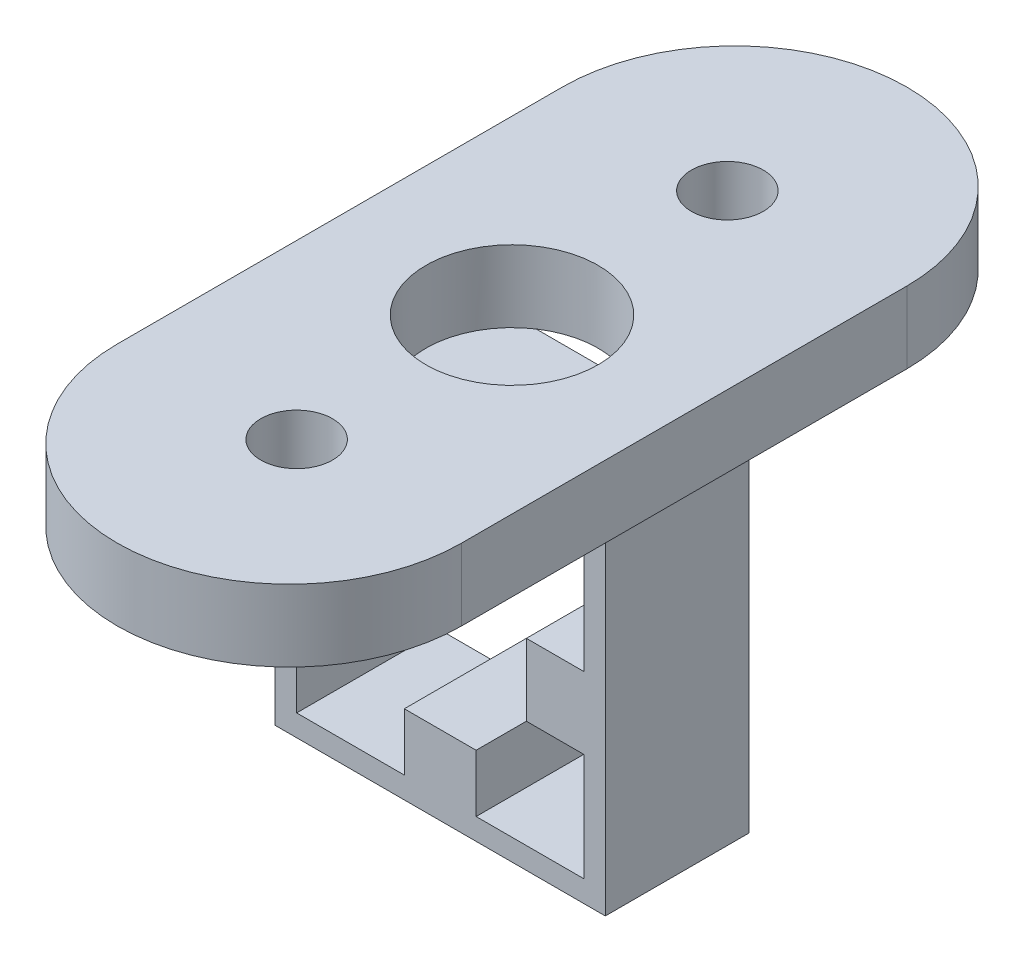
ISO-10303-21;
HEADER;
FILE_DESCRIPTION(('STEP AP214'),'2;1');
FILE_NAME('part.step','',(''),(''),'','','');
FILE_SCHEMA(('AUTOMOTIVE_DESIGN { 1 0 10303 214 1 1 1 1 }'));
ENDSEC;
DATA;
#1=APPLICATION_CONTEXT('core data for automotive mechanical design processes');
#2=APPLICATION_PROTOCOL_DEFINITION('international standard','automotive_design',2000,#1);
#3=PRODUCT_CONTEXT('',#1,'mechanical');
#4=PRODUCT('Part','Part','',(#3));
#5=PRODUCT_RELATED_PRODUCT_CATEGORY('part','',(#4));
#6=PRODUCT_DEFINITION_FORMATION('','',#4);
#7=PRODUCT_DEFINITION_CONTEXT('part definition',#1,'design');
#8=PRODUCT_DEFINITION('design','',#6,#7);
#9=PRODUCT_DEFINITION_SHAPE('','',#8);
#10=(LENGTH_UNIT() NAMED_UNIT(*) SI_UNIT(.MILLI.,.METRE.));
#11=(NAMED_UNIT(*) PLANE_ANGLE_UNIT() SI_UNIT($,.RADIAN.));
#12=(NAMED_UNIT(*) SI_UNIT($,.STERADIAN.) SOLID_ANGLE_UNIT());
#13=UNCERTAINTY_MEASURE_WITH_UNIT(LENGTH_MEASURE(1.E-05),#10,'distance_accuracy_value','');
#14=(GEOMETRIC_REPRESENTATION_CONTEXT(3) GLOBAL_UNCERTAINTY_ASSIGNED_CONTEXT((#13)) GLOBAL_UNIT_ASSIGNED_CONTEXT((#10,
#11,#12)) REPRESENTATION_CONTEXT('',''));
#15=CARTESIAN_POINT('',(0.,0.,0.));
#16=DIRECTION('',(0.,0.,1.));
#17=DIRECTION('',(1.,0.,0.));
#18=AXIS2_PLACEMENT_3D('',#15,#16,#17);
#19=CARTESIAN_POINT('',(11.5,11.5,10.));
#20=DIRECTION('',(0.,-1.,0.));
#21=DIRECTION('',(0.,0.,-1.));
#22=AXIS2_PLACEMENT_3D('',#19,#20,#21);
#23=PLANE('',#22);
#24=DIRECTION('',(-1.,0.,0.));
#25=VECTOR('',#24,1.);
#26=CARTESIAN_POINT('',(11.5,11.5,10.));
#27=LINE('',#26,#25);
#28=CARTESIAN_POINT('',(3.3166247903554,11.5,10.));
#29=VERTEX_POINT('',#28);
#30=CARTESIAN_POINT('',(-3.3166247903554,11.5,10.));
#31=VERTEX_POINT('',#30);
#32=EDGE_CURVE('E495',#29,#31,#27,.T.);
#33=ORIENTED_EDGE('',*,*,#32,.F.);
#34=CARTESIAN_POINT('',(0.,11.5,5.));
#35=DIRECTION('',(0.,1.,0.));
#36=DIRECTION('',(0.,0.,1.));
#37=AXIS2_PLACEMENT_3D('',#34,#35,#36);
#38=CIRCLE('',#37,6.);
#39=CARTESIAN_POINT('',(3.3166247903554,11.5,0.));
#40=VERTEX_POINT('',#39);
#41=EDGE_CURVE('E50',#29,#40,#38,.T.);
#42=ORIENTED_EDGE('',*,*,#41,.T.);
#43=DIRECTION('',(-1.,0.,0.));
#44=VECTOR('',#43,1.);
#45=CARTESIAN_POINT('',(11.5,11.5,0.));
#46=LINE('',#45,#44);
#47=CARTESIAN_POINT('',(-3.31662479035541,11.5,0.));
#48=VERTEX_POINT('',#47);
#49=EDGE_CURVE('E509',#40,#48,#46,.T.);
#50=ORIENTED_EDGE('',*,*,#49,.T.);
#51=EDGE_CURVE('E11',#48,#31,#38,.T.);
#52=ORIENTED_EDGE('',*,*,#51,.T.);
#53=EDGE_LOOP('',(#33,#42,#50,#52));
#54=FACE_BOUND('',#53,.T.);
#55=ADVANCED_FACE('F39',(#54),#23,.F.);
#56=CARTESIAN_POINT('',(0.,0.,10.));
#57=DIRECTION('',(0.,0.,1.));
#58=DIRECTION('',(1.,0.,0.));
#59=AXIS2_PLACEMENT_3D('',#56,#57,#58);
#60=PLANE('',#59);
#61=DIRECTION('',(0.,-1.,0.));
#62=VECTOR('',#61,1.);
#63=CARTESIAN_POINT('',(-11.5,-11.5,10.));
#64=LINE('',#63,#62);
#65=CARTESIAN_POINT('',(-11.5,11.5,10.));
#66=VERTEX_POINT('',#65);
#67=CARTESIAN_POINT('',(-11.5,-11.5,10.));
#68=VERTEX_POINT('',#67);
#69=EDGE_CURVE('E477',#66,#68,#64,.T.);
#70=ORIENTED_EDGE('',*,*,#69,.T.);
#71=DIRECTION('',(1.,0.,0.));
#72=VECTOR('',#71,1.);
#73=CARTESIAN_POINT('',(11.5,-11.5,10.));
#74=LINE('',#73,#72);
#75=CARTESIAN_POINT('',(11.5,-11.5,10.));
#76=VERTEX_POINT('',#75);
#77=EDGE_CURVE('E481',#68,#76,#74,.T.);
#78=ORIENTED_EDGE('',*,*,#77,.T.);
#79=DIRECTION('',(0.,1.,0.));
#80=VECTOR('',#79,1.);
#81=CARTESIAN_POINT('',(11.5,-11.5,10.));
#82=LINE('',#81,#80);
#83=CARTESIAN_POINT('',(11.5,11.5,10.));
#84=VERTEX_POINT('',#83);
#85=EDGE_CURVE('E485',#76,#84,#82,.T.);
#86=ORIENTED_EDGE('',*,*,#85,.T.);
#87=EDGE_CURVE('E490',#84,#29,#27,.T.);
#88=ORIENTED_EDGE('',*,*,#87,.T.);
#89=ORIENTED_EDGE('',*,*,#32,.T.);
#90=EDGE_CURVE('E489',#31,#66,#27,.T.);
#91=ORIENTED_EDGE('',*,*,#90,.T.);
#92=EDGE_LOOP('',(#70,#78,#86,#88,#89,#91));
#93=FACE_BOUND('',#92,.T.);
#94=DIRECTION('',(1.,0.,0.));
#95=VECTOR('',#94,1.);
#96=CARTESIAN_POINT('',(-10.,2.49999999999941,10.));
#97=LINE('',#96,#95);
#98=CARTESIAN_POINT('',(-10.,2.49999999999941,10.));
#99=VERTEX_POINT('',#98);
#100=CARTESIAN_POINT('',(-5.99999999999971,2.49999999999941,10.));
#101=VERTEX_POINT('',#100);
#102=EDGE_CURVE('E281',#99,#101,#97,.T.);
#103=ORIENTED_EDGE('',*,*,#102,.F.);
#104=DIRECTION('',(0.,-1.,0.));
#105=VECTOR('',#104,1.);
#106=CARTESIAN_POINT('',(-10.,2.49999999999941,10.));
#107=LINE('',#106,#105);
#108=CARTESIAN_POINT('',(-10.,10.,10.));
#109=VERTEX_POINT('',#108);
#110=EDGE_CURVE('E278',#109,#99,#107,.T.);
#111=ORIENTED_EDGE('',*,*,#110,.F.);
#112=DIRECTION('',(-1.,0.,0.));
#113=VECTOR('',#112,1.);
#114=CARTESIAN_POINT('',(-2.50000000000043,10.,10.));
#115=LINE('',#114,#113);
#116=CARTESIAN_POINT('',(-2.50000000000043,10.,10.));
#117=VERTEX_POINT('',#116);
#118=EDGE_CURVE('E337',#117,#109,#115,.T.);
#119=ORIENTED_EDGE('',*,*,#118,.F.);
#120=DIRECTION('',(0.,1.,0.));
#121=VECTOR('',#120,1.);
#122=CARTESIAN_POINT('',(-2.50000000000043,10.,10.));
#123=LINE('',#122,#121);
#124=CARTESIAN_POINT('',(-2.50000000000043,5.99999999999971,10.));
#125=VERTEX_POINT('',#124);
#126=EDGE_CURVE('E333',#125,#117,#123,.T.);
#127=ORIENTED_EDGE('',*,*,#126,.F.);
#128=DIRECTION('',(-1.,0.,0.));
#129=VECTOR('',#128,1.);
#130=CARTESIAN_POINT('',(-2.50000000000043,5.99999999999971,10.));
#131=LINE('',#130,#129);
#132=CARTESIAN_POINT('',(2.49999999999957,5.99999999999971,10.));
#133=VERTEX_POINT('',#132);
#134=EDGE_CURVE('E330',#133,#125,#131,.T.);
#135=ORIENTED_EDGE('',*,*,#134,.F.);
#136=DIRECTION('',(0.,-1.,0.));
#137=VECTOR('',#136,1.);
#138=CARTESIAN_POINT('',(2.49999999999957,10.,10.));
#139=LINE('',#138,#137);
#140=CARTESIAN_POINT('',(2.49999999999957,10.,10.));
#141=VERTEX_POINT('',#140);
#142=EDGE_CURVE('E327',#141,#133,#139,.T.);
#143=ORIENTED_EDGE('',*,*,#142,.F.);
#144=DIRECTION('',(-1.,0.,0.));
#145=VECTOR('',#144,1.);
#146=CARTESIAN_POINT('',(10.,10.,10.));
#147=LINE('',#146,#145);
#148=CARTESIAN_POINT('',(10.,10.,10.));
#149=VERTEX_POINT('',#148);
#150=EDGE_CURVE('E324',#149,#141,#147,.T.);
#151=ORIENTED_EDGE('',*,*,#150,.F.);
#152=DIRECTION('',(0.,1.,0.));
#153=VECTOR('',#152,1.);
#154=CARTESIAN_POINT('',(9.99999999999985,2.50000000000043,10.));
#155=LINE('',#154,#153);
#156=CARTESIAN_POINT('',(9.99999999999985,2.50000000000043,10.));
#157=VERTEX_POINT('',#156);
#158=EDGE_CURVE('E321',#157,#149,#155,.T.);
#159=ORIENTED_EDGE('',*,*,#158,.F.);
#160=DIRECTION('',(1.,0.,0.));
#161=VECTOR('',#160,1.);
#162=CARTESIAN_POINT('',(9.99999999999985,2.50000000000043,10.));
#163=LINE('',#162,#161);
#164=CARTESIAN_POINT('',(5.99999999999956,2.50000000000043,10.));
#165=VERTEX_POINT('',#164);
#166=EDGE_CURVE('E318',#165,#157,#163,.T.);
#167=ORIENTED_EDGE('',*,*,#166,.F.);
#168=DIRECTION('',(0.,1.,0.));
#169=VECTOR('',#168,1.);
#170=CARTESIAN_POINT('',(5.99999999999956,2.50000000000043,10.));
#171=LINE('',#170,#169);
#172=CARTESIAN_POINT('',(5.99999999999956,-2.49999999999957,10.));
#173=VERTEX_POINT('',#172);
#174=EDGE_CURVE('E315',#173,#165,#171,.T.);
#175=ORIENTED_EDGE('',*,*,#174,.F.);
#176=DIRECTION('',(-1.,0.,0.));
#177=VECTOR('',#176,1.);
#178=CARTESIAN_POINT('',(10.0000000000002,-2.49999999999957,10.));
#179=LINE('',#178,#177);
#180=CARTESIAN_POINT('',(10.0000000000002,-2.49999999999957,10.));
#181=VERTEX_POINT('',#180);
#182=EDGE_CURVE('E312',#181,#173,#179,.T.);
#183=ORIENTED_EDGE('',*,*,#182,.F.);
#184=DIRECTION('',(0.,1.,0.));
#185=VECTOR('',#184,1.);
#186=CARTESIAN_POINT('',(10.,-10.,10.));
#187=LINE('',#186,#185);
#188=CARTESIAN_POINT('',(10.,-10.,10.));
#189=VERTEX_POINT('',#188);
#190=EDGE_CURVE('E309',#189,#181,#187,.T.);
#191=ORIENTED_EDGE('',*,*,#190,.F.);
#192=DIRECTION('',(1.,0.,0.));
#193=VECTOR('',#192,1.);
#194=CARTESIAN_POINT('',(10.,-10.,10.));
#195=LINE('',#194,#193);
#196=CARTESIAN_POINT('',(2.50000000000059,-10.0000000000002,10.));
#197=VERTEX_POINT('',#196);
#198=EDGE_CURVE('E306',#197,#189,#195,.T.);
#199=ORIENTED_EDGE('',*,*,#198,.F.);
#200=DIRECTION('',(0.,-1.,0.));
#201=VECTOR('',#200,1.);
#202=CARTESIAN_POINT('',(2.50000000000059,-10.0000000000002,10.));
#203=LINE('',#202,#201);
#204=CARTESIAN_POINT('',(2.50000000000059,-5.99999999999955,10.));
#205=VERTEX_POINT('',#204);
#206=EDGE_CURVE('E303',#205,#197,#203,.T.);
#207=ORIENTED_EDGE('',*,*,#206,.F.);
#208=DIRECTION('',(1.,0.,0.));
#209=VECTOR('',#208,1.);
#210=CARTESIAN_POINT('',(2.50000000000059,-5.99999999999955,10.));
#211=LINE('',#210,#209);
#212=CARTESIAN_POINT('',(-2.49999999999941,-5.99999999999955,10.));
#213=VERTEX_POINT('',#212);
#214=EDGE_CURVE('E300',#213,#205,#211,.T.);
#215=ORIENTED_EDGE('',*,*,#214,.F.);
#216=DIRECTION('',(0.,1.,0.));
#217=VECTOR('',#216,1.);
#218=CARTESIAN_POINT('',(-2.49999999999941,-10.0000000000002,10.));
#219=LINE('',#218,#217);
#220=CARTESIAN_POINT('',(-2.49999999999941,-10.0000000000002,10.));
#221=VERTEX_POINT('',#220);
#222=EDGE_CURVE('E297',#221,#213,#219,.T.);
#223=ORIENTED_EDGE('',*,*,#222,.F.);
#224=DIRECTION('',(1.,0.,0.));
#225=VECTOR('',#224,1.);
#226=CARTESIAN_POINT('',(-2.49999999999941,-10.0000000000002,10.));
#227=LINE('',#226,#225);
#228=CARTESIAN_POINT('',(-10.,-10.,10.));
#229=VERTEX_POINT('',#228);
#230=EDGE_CURVE('E294',#229,#221,#227,.T.);
#231=ORIENTED_EDGE('',*,*,#230,.F.);
#232=DIRECTION('',(0.,-1.,0.));
#233=VECTOR('',#232,1.);
#234=CARTESIAN_POINT('',(-10.,-10.,10.));
#235=LINE('',#234,#233);
#236=CARTESIAN_POINT('',(-10.,-2.50000000000059,10.));
#237=VERTEX_POINT('',#236);
#238=EDGE_CURVE('E291',#237,#229,#235,.T.);
#239=ORIENTED_EDGE('',*,*,#238,.F.);
#240=DIRECTION('',(-1.,0.,0.));
#241=VECTOR('',#240,1.);
#242=CARTESIAN_POINT('',(-10.,-2.50000000000059,10.));
#243=LINE('',#242,#241);
#244=CARTESIAN_POINT('',(-5.99999999999971,-2.50000000000059,10.));
#245=VERTEX_POINT('',#244);
#246=EDGE_CURVE('E288',#245,#237,#243,.T.);
#247=ORIENTED_EDGE('',*,*,#246,.F.);
#248=DIRECTION('',(0.,-1.,0.));
#249=VECTOR('',#248,1.);
#250=CARTESIAN_POINT('',(-5.99999999999971,-2.50000000000059,10.));
#251=LINE('',#250,#249);
#252=EDGE_CURVE('E285',#101,#245,#251,.T.);
#253=ORIENTED_EDGE('',*,*,#252,.F.);
#254=EDGE_LOOP('',(#103,#111,#119,#127,#135,#143,#151,#159,#167,#175,#183,#191,#199,#207,#215,
#223,#231,#239,#247,#253));
#255=FACE_BOUND('',#254,.T.);
#256=ADVANCED_FACE('F544',(#93,#255),#60,.T.);
#257=CARTESIAN_POINT('',(0.,0.,0.));
#258=DIRECTION('',(0.,0.,1.));
#259=DIRECTION('',(1.,0.,0.));
#260=AXIS2_PLACEMENT_3D('',#257,#258,#259);
#261=PLANE('',#260);
#262=DIRECTION('',(0.,-1.,0.));
#263=VECTOR('',#262,1.);
#264=CARTESIAN_POINT('',(-11.5,-11.5,0.));
#265=LINE('',#264,#263);
#266=CARTESIAN_POINT('',(-11.5,11.5,0.));
#267=VERTEX_POINT('',#266);
#268=CARTESIAN_POINT('',(-11.5,-11.5,0.));
#269=VERTEX_POINT('',#268);
#270=EDGE_CURVE('E476',#267,#269,#265,.T.);
#271=ORIENTED_EDGE('',*,*,#270,.F.);
#272=EDGE_CURVE('E506',#48,#267,#46,.T.);
#273=ORIENTED_EDGE('',*,*,#272,.F.);
#274=ORIENTED_EDGE('',*,*,#49,.F.);
#275=CARTESIAN_POINT('',(11.5,11.5,0.));
#276=VERTEX_POINT('',#275);
#277=EDGE_CURVE('E482',#276,#40,#46,.T.);
#278=ORIENTED_EDGE('',*,*,#277,.F.);
#279=DIRECTION('',(0.,1.,0.));
#280=VECTOR('',#279,1.);
#281=CARTESIAN_POINT('',(11.5,-11.5,0.));
#282=LINE('',#281,#280);
#283=CARTESIAN_POINT('',(11.5,-11.5,0.));
#284=VERTEX_POINT('',#283);
#285=EDGE_CURVE('E502',#284,#276,#282,.T.);
#286=ORIENTED_EDGE('',*,*,#285,.F.);
#287=DIRECTION('',(1.,0.,0.));
#288=VECTOR('',#287,1.);
#289=CARTESIAN_POINT('',(11.5,-11.5,0.));
#290=LINE('',#289,#288);
#291=EDGE_CURVE('E499',#269,#284,#290,.T.);
#292=ORIENTED_EDGE('',*,*,#291,.F.);
#293=EDGE_LOOP('',(#271,#273,#274,#278,#286,#292));
#294=FACE_BOUND('',#293,.T.);
#295=DIRECTION('',(0.,-1.,0.));
#296=VECTOR('',#295,1.);
#297=CARTESIAN_POINT('',(-10.,2.49999999999941,0.));
#298=LINE('',#297,#296);
#299=CARTESIAN_POINT('',(-10.,10.,0.));
#300=VERTEX_POINT('',#299);
#301=CARTESIAN_POINT('',(-10.,2.49999999999941,0.));
#302=VERTEX_POINT('',#301);
#303=EDGE_CURVE('E267',#300,#302,#298,.T.);
#304=ORIENTED_EDGE('',*,*,#303,.T.);
#305=DIRECTION('',(1.,0.,0.));
#306=VECTOR('',#305,1.);
#307=CARTESIAN_POINT('',(-10.,2.49999999999941,0.));
#308=LINE('',#307,#306);
#309=CARTESIAN_POINT('',(-5.99999999999971,2.49999999999941,0.));
#310=VERTEX_POINT('',#309);
#311=EDGE_CURVE('E272',#302,#310,#308,.T.);
#312=ORIENTED_EDGE('',*,*,#311,.T.);
#313=DIRECTION('',(0.,-1.,0.));
#314=VECTOR('',#313,1.);
#315=CARTESIAN_POINT('',(-5.99999999999971,-2.50000000000059,0.));
#316=LINE('',#315,#314);
#317=CARTESIAN_POINT('',(-5.99999999999971,-2.50000000000059,0.));
#318=VERTEX_POINT('',#317);
#319=EDGE_CURVE('E344',#310,#318,#316,.T.);
#320=ORIENTED_EDGE('',*,*,#319,.T.);
#321=DIRECTION('',(-1.,0.,0.));
#322=VECTOR('',#321,1.);
#323=CARTESIAN_POINT('',(-10.,-2.50000000000059,0.));
#324=LINE('',#323,#322);
#325=CARTESIAN_POINT('',(-10.,-2.50000000000059,0.));
#326=VERTEX_POINT('',#325);
#327=EDGE_CURVE('E348',#318,#326,#324,.T.);
#328=ORIENTED_EDGE('',*,*,#327,.T.);
#329=DIRECTION('',(0.,-1.,0.));
#330=VECTOR('',#329,1.);
#331=CARTESIAN_POINT('',(-10.,-10.,0.));
#332=LINE('',#331,#330);
#333=CARTESIAN_POINT('',(-10.,-10.,0.));
#334=VERTEX_POINT('',#333);
#335=EDGE_CURVE('E352',#326,#334,#332,.T.);
#336=ORIENTED_EDGE('',*,*,#335,.T.);
#337=DIRECTION('',(1.,0.,0.));
#338=VECTOR('',#337,1.);
#339=CARTESIAN_POINT('',(-2.49999999999941,-10.0000000000002,0.));
#340=LINE('',#339,#338);
#341=CARTESIAN_POINT('',(-2.49999999999941,-10.0000000000002,0.));
#342=VERTEX_POINT('',#341);
#343=EDGE_CURVE('E356',#334,#342,#340,.T.);
#344=ORIENTED_EDGE('',*,*,#343,.T.);
#345=DIRECTION('',(0.,1.,0.));
#346=VECTOR('',#345,1.);
#347=CARTESIAN_POINT('',(-2.49999999999941,-10.0000000000002,0.));
#348=LINE('',#347,#346);
#349=CARTESIAN_POINT('',(-2.49999999999941,-5.99999999999955,0.));
#350=VERTEX_POINT('',#349);
#351=EDGE_CURVE('E360',#342,#350,#348,.T.);
#352=ORIENTED_EDGE('',*,*,#351,.T.);
#353=DIRECTION('',(1.,0.,0.));
#354=VECTOR('',#353,1.);
#355=CARTESIAN_POINT('',(2.50000000000059,-5.99999999999955,0.));
#356=LINE('',#355,#354);
#357=CARTESIAN_POINT('',(2.50000000000059,-5.99999999999955,0.));
#358=VERTEX_POINT('',#357);
#359=EDGE_CURVE('E364',#350,#358,#356,.T.);
#360=ORIENTED_EDGE('',*,*,#359,.T.);
#361=DIRECTION('',(0.,-1.,0.));
#362=VECTOR('',#361,1.);
#363=CARTESIAN_POINT('',(2.50000000000059,-10.0000000000002,0.));
#364=LINE('',#363,#362);
#365=CARTESIAN_POINT('',(2.50000000000059,-10.0000000000002,0.));
#366=VERTEX_POINT('',#365);
#367=EDGE_CURVE('E368',#358,#366,#364,.T.);
#368=ORIENTED_EDGE('',*,*,#367,.T.);
#369=DIRECTION('',(1.,0.,0.));
#370=VECTOR('',#369,1.);
#371=CARTESIAN_POINT('',(10.,-10.,0.));
#372=LINE('',#371,#370);
#373=CARTESIAN_POINT('',(10.,-10.,0.));
#374=VERTEX_POINT('',#373);
#375=EDGE_CURVE('E372',#366,#374,#372,.T.);
#376=ORIENTED_EDGE('',*,*,#375,.T.);
#377=DIRECTION('',(0.,1.,0.));
#378=VECTOR('',#377,1.);
#379=CARTESIAN_POINT('',(10.,-10.,0.));
#380=LINE('',#379,#378);
#381=CARTESIAN_POINT('',(10.0000000000002,-2.49999999999957,0.));
#382=VERTEX_POINT('',#381);
#383=EDGE_CURVE('E376',#374,#382,#380,.T.);
#384=ORIENTED_EDGE('',*,*,#383,.T.);
#385=DIRECTION('',(-1.,0.,0.));
#386=VECTOR('',#385,1.);
#387=CARTESIAN_POINT('',(10.0000000000002,-2.49999999999957,0.));
#388=LINE('',#387,#386);
#389=CARTESIAN_POINT('',(5.99999999999956,-2.49999999999957,0.));
#390=VERTEX_POINT('',#389);
#391=EDGE_CURVE('E380',#382,#390,#388,.T.);
#392=ORIENTED_EDGE('',*,*,#391,.T.);
#393=DIRECTION('',(0.,1.,0.));
#394=VECTOR('',#393,1.);
#395=CARTESIAN_POINT('',(5.99999999999956,2.50000000000043,0.));
#396=LINE('',#395,#394);
#397=CARTESIAN_POINT('',(5.99999999999956,2.50000000000043,0.));
#398=VERTEX_POINT('',#397);
#399=EDGE_CURVE('E384',#390,#398,#396,.T.);
#400=ORIENTED_EDGE('',*,*,#399,.T.);
#401=DIRECTION('',(1.,0.,0.));
#402=VECTOR('',#401,1.);
#403=CARTESIAN_POINT('',(9.99999999999985,2.50000000000043,0.));
#404=LINE('',#403,#402);
#405=CARTESIAN_POINT('',(9.99999999999985,2.50000000000043,0.));
#406=VERTEX_POINT('',#405);
#407=EDGE_CURVE('E388',#398,#406,#404,.T.);
#408=ORIENTED_EDGE('',*,*,#407,.T.);
#409=DIRECTION('',(0.,1.,0.));
#410=VECTOR('',#409,1.);
#411=CARTESIAN_POINT('',(9.99999999999985,2.50000000000043,0.));
#412=LINE('',#411,#410);
#413=CARTESIAN_POINT('',(10.,10.,0.));
#414=VERTEX_POINT('',#413);
#415=EDGE_CURVE('E392',#406,#414,#412,.T.);
#416=ORIENTED_EDGE('',*,*,#415,.T.);
#417=DIRECTION('',(-1.,0.,0.));
#418=VECTOR('',#417,1.);
#419=CARTESIAN_POINT('',(10.,10.,0.));
#420=LINE('',#419,#418);
#421=CARTESIAN_POINT('',(2.49999999999957,10.,0.));
#422=VERTEX_POINT('',#421);
#423=EDGE_CURVE('E396',#414,#422,#420,.T.);
#424=ORIENTED_EDGE('',*,*,#423,.T.);
#425=DIRECTION('',(0.,-1.,0.));
#426=VECTOR('',#425,1.);
#427=CARTESIAN_POINT('',(2.49999999999957,10.,0.));
#428=LINE('',#427,#426);
#429=CARTESIAN_POINT('',(2.49999999999957,5.99999999999971,0.));
#430=VERTEX_POINT('',#429);
#431=EDGE_CURVE('E400',#422,#430,#428,.T.);
#432=ORIENTED_EDGE('',*,*,#431,.T.);
#433=DIRECTION('',(-1.,0.,0.));
#434=VECTOR('',#433,1.);
#435=CARTESIAN_POINT('',(-2.50000000000043,5.99999999999971,0.));
#436=LINE('',#435,#434);
#437=CARTESIAN_POINT('',(-2.50000000000043,5.99999999999971,0.));
#438=VERTEX_POINT('',#437);
#439=EDGE_CURVE('E404',#430,#438,#436,.T.);
#440=ORIENTED_EDGE('',*,*,#439,.T.);
#441=DIRECTION('',(0.,1.,0.));
#442=VECTOR('',#441,1.);
#443=CARTESIAN_POINT('',(-2.50000000000043,10.,0.));
#444=LINE('',#443,#442);
#445=CARTESIAN_POINT('',(-2.50000000000043,10.,0.));
#446=VERTEX_POINT('',#445);
#447=EDGE_CURVE('E408',#438,#446,#444,.T.);
#448=ORIENTED_EDGE('',*,*,#447,.T.);
#449=DIRECTION('',(-1.,0.,0.));
#450=VECTOR('',#449,1.);
#451=CARTESIAN_POINT('',(-2.50000000000043,10.,0.));
#452=LINE('',#451,#450);
#453=EDGE_CURVE('E282',#446,#300,#452,.T.);
#454=ORIENTED_EDGE('',*,*,#453,.T.);
#455=EDGE_LOOP('',(#304,#312,#320,#328,#336,#344,#352,#360,#368,#376,#384,#392,#400,#408,#416,
#424,#432,#440,#448,#454));
#456=FACE_BOUND('',#455,.T.);
#457=ADVANCED_FACE('F532',(#294,#456),#261,.F.);
#458=CARTESIAN_POINT('',(-11.5,-11.5,10.));
#459=DIRECTION('',(1.,0.,0.));
#460=DIRECTION('',(0.,0.,-1.));
#461=AXIS2_PLACEMENT_3D('',#458,#459,#460);
#462=PLANE('',#461);
#463=ORIENTED_EDGE('',*,*,#270,.T.);
#464=DIRECTION('',(0.,0.,-1.));
#465=VECTOR('',#464,1.);
#466=CARTESIAN_POINT('',(-11.5,-11.5,10.));
#467=LINE('',#466,#465);
#468=EDGE_CURVE('E43',#68,#269,#467,.T.);
#469=ORIENTED_EDGE('',*,*,#468,.F.);
#470=ORIENTED_EDGE('',*,*,#69,.F.);
#471=DIRECTION('',(0.,0.,-1.));
#472=VECTOR('',#471,1.);
#473=CARTESIAN_POINT('',(-11.5,11.5,10.));
#474=LINE('',#473,#472);
#475=EDGE_CURVE('E494',#66,#267,#474,.T.);
#476=ORIENTED_EDGE('',*,*,#475,.T.);
#477=EDGE_LOOP('',(#463,#469,#470,#476));
#478=FACE_BOUND('',#477,.T.);
#479=ADVANCED_FACE('F41',(#478),#462,.F.);
#480=CARTESIAN_POINT('',(11.5,-11.5,10.));
#481=DIRECTION('',(0.,1.,0.));
#482=DIRECTION('',(0.,0.,1.));
#483=AXIS2_PLACEMENT_3D('',#480,#481,#482);
#484=PLANE('',#483);
#485=ORIENTED_EDGE('',*,*,#291,.T.);
#486=DIRECTION('',(0.,0.,-1.));
#487=VECTOR('',#486,1.);
#488=CARTESIAN_POINT('',(11.5,-11.5,10.));
#489=LINE('',#488,#487);
#490=EDGE_CURVE('E515',#76,#284,#489,.T.);
#491=ORIENTED_EDGE('',*,*,#490,.F.);
#492=ORIENTED_EDGE('',*,*,#77,.F.);
#493=ORIENTED_EDGE('',*,*,#468,.T.);
#494=EDGE_LOOP('',(#485,#491,#492,#493));
#495=FACE_BOUND('',#494,.T.);
#496=ADVANCED_FACE('F526',(#495),#484,.F.);
#497=CARTESIAN_POINT('',(11.5,-11.5,10.));
#498=DIRECTION('',(-1.,0.,0.));
#499=DIRECTION('',(0.,0.,1.));
#500=AXIS2_PLACEMENT_3D('',#497,#498,#499);
#501=PLANE('',#500);
#502=ORIENTED_EDGE('',*,*,#285,.T.);
#503=DIRECTION('',(0.,0.,-1.));
#504=VECTOR('',#503,1.);
#505=CARTESIAN_POINT('',(11.5,11.5,10.));
#506=LINE('',#505,#504);
#507=EDGE_CURVE('E513',#84,#276,#506,.T.);
#508=ORIENTED_EDGE('',*,*,#507,.F.);
#509=ORIENTED_EDGE('',*,*,#85,.F.);
#510=ORIENTED_EDGE('',*,*,#490,.T.);
#511=EDGE_LOOP('',(#502,#508,#509,#510));
#512=FACE_BOUND('',#511,.T.);
#513=ADVANCED_FACE('F538',(#512),#501,.F.);
#514=CARTESIAN_POINT('',(-10.,2.49999999999941,10.));
#515=DIRECTION('',(1.,0.,0.));
#516=DIRECTION('',(0.,0.,-1.));
#517=AXIS2_PLACEMENT_3D('',#514,#515,#516);
#518=PLANE('',#517);
#519=ORIENTED_EDGE('',*,*,#303,.F.);
#520=DIRECTION('',(0.,0.,-1.));
#521=VECTOR('',#520,1.);
#522=CARTESIAN_POINT('',(-10.,10.,10.));
#523=LINE('',#522,#521);
#524=EDGE_CURVE('E339',#109,#300,#523,.T.);
#525=ORIENTED_EDGE('',*,*,#524,.F.);
#526=ORIENTED_EDGE('',*,*,#110,.T.);
#527=DIRECTION('',(0.,0.,-1.));
#528=VECTOR('',#527,1.);
#529=CARTESIAN_POINT('',(-10.,2.49999999999941,10.));
#530=LINE('',#529,#528);
#531=EDGE_CURVE('E472',#99,#302,#530,.T.);
#532=ORIENTED_EDGE('',*,*,#531,.T.);
#533=EDGE_LOOP('',(#519,#525,#526,#532));
#534=FACE_BOUND('',#533,.T.);
#535=ADVANCED_FACE('F620',(#534),#518,.T.);
#536=CARTESIAN_POINT('',(-10.,2.49999999999941,10.));
#537=DIRECTION('',(0.,1.,0.));
#538=DIRECTION('',(-1.,0.,0.));
#539=AXIS2_PLACEMENT_3D('',#536,#537,#538);
#540=PLANE('',#539);
#541=ORIENTED_EDGE('',*,*,#311,.F.);
#542=ORIENTED_EDGE('',*,*,#531,.F.);
#543=ORIENTED_EDGE('',*,*,#102,.T.);
#544=DIRECTION('',(0.,0.,-1.));
#545=VECTOR('',#544,1.);
#546=CARTESIAN_POINT('',(-5.99999999999971,2.49999999999941,10.));
#547=LINE('',#546,#545);
#548=EDGE_CURVE('E469',#101,#310,#547,.T.);
#549=ORIENTED_EDGE('',*,*,#548,.T.);
#550=EDGE_LOOP('',(#541,#542,#543,#549));
#551=FACE_BOUND('',#550,.T.);
#552=ADVANCED_FACE('F820',(#551),#540,.T.);
#553=CARTESIAN_POINT('',(-5.99999999999971,-2.50000000000059,10.));
#554=DIRECTION('',(1.,0.,0.));
#555=DIRECTION('',(0.,1.,0.));
#556=AXIS2_PLACEMENT_3D('',#553,#554,#555);
#557=PLANE('',#556);
#558=ORIENTED_EDGE('',*,*,#319,.F.);
#559=ORIENTED_EDGE('',*,*,#548,.F.);
#560=ORIENTED_EDGE('',*,*,#252,.T.);
#561=DIRECTION('',(0.,0.,-1.));
#562=VECTOR('',#561,1.);
#563=CARTESIAN_POINT('',(-5.99999999999971,-2.50000000000059,10.));
#564=LINE('',#563,#562);
#565=EDGE_CURVE('E466',#245,#318,#564,.T.);
#566=ORIENTED_EDGE('',*,*,#565,.T.);
#567=EDGE_LOOP('',(#558,#559,#560,#566));
#568=FACE_BOUND('',#567,.T.);
#569=ADVANCED_FACE('F810',(#568),#557,.T.);
#570=CARTESIAN_POINT('',(-10.,-2.50000000000059,10.));
#571=DIRECTION('',(0.,-1.,0.));
#572=DIRECTION('',(0.,0.,-1.));
#573=AXIS2_PLACEMENT_3D('',#570,#571,#572);
#574=PLANE('',#573);
#575=ORIENTED_EDGE('',*,*,#327,.F.);
#576=ORIENTED_EDGE('',*,*,#565,.F.);
#577=ORIENTED_EDGE('',*,*,#246,.T.);
#578=DIRECTION('',(0.,0.,-1.));
#579=VECTOR('',#578,1.);
#580=CARTESIAN_POINT('',(-10.,-2.50000000000059,10.));
#581=LINE('',#580,#579);
#582=EDGE_CURVE('E463',#237,#326,#581,.T.);
#583=ORIENTED_EDGE('',*,*,#582,.T.);
#584=EDGE_LOOP('',(#575,#576,#577,#583));
#585=FACE_BOUND('',#584,.T.);
#586=ADVANCED_FACE('F800',(#585),#574,.T.);
#587=CARTESIAN_POINT('',(-10.,-10.,10.));
#588=DIRECTION('',(1.,0.,0.));
#589=DIRECTION('',(0.,0.,-1.));
#590=AXIS2_PLACEMENT_3D('',#587,#588,#589);
#591=PLANE('',#590);
#592=ORIENTED_EDGE('',*,*,#335,.F.);
#593=ORIENTED_EDGE('',*,*,#582,.F.);
#594=ORIENTED_EDGE('',*,*,#238,.T.);
#595=DIRECTION('',(0.,0.,-1.));
#596=VECTOR('',#595,1.);
#597=CARTESIAN_POINT('',(-10.,-10.,10.));
#598=LINE('',#597,#596);
#599=EDGE_CURVE('E460',#229,#334,#598,.T.);
#600=ORIENTED_EDGE('',*,*,#599,.T.);
#601=EDGE_LOOP('',(#592,#593,#594,#600));
#602=FACE_BOUND('',#601,.T.);
#603=ADVANCED_FACE('F790',(#602),#591,.T.);
#604=CARTESIAN_POINT('',(-2.49999999999941,-10.0000000000002,10.));
#605=DIRECTION('',(0.,1.,0.));
#606=DIRECTION('',(-1.,0.,0.));
#607=AXIS2_PLACEMENT_3D('',#604,#605,#606);
#608=PLANE('',#607);
#609=ORIENTED_EDGE('',*,*,#343,.F.);
#610=ORIENTED_EDGE('',*,*,#599,.F.);
#611=ORIENTED_EDGE('',*,*,#230,.T.);
#612=DIRECTION('',(0.,0.,-1.));
#613=VECTOR('',#612,1.);
#614=CARTESIAN_POINT('',(-2.49999999999941,-10.0000000000002,10.));
#615=LINE('',#614,#613);
#616=EDGE_CURVE('E457',#221,#342,#615,.T.);
#617=ORIENTED_EDGE('',*,*,#616,.T.);
#618=EDGE_LOOP('',(#609,#610,#611,#617));
#619=FACE_BOUND('',#618,.T.);
#620=ADVANCED_FACE('F780',(#619),#608,.T.);
#621=CARTESIAN_POINT('',(-2.49999999999941,-10.0000000000002,10.));
#622=DIRECTION('',(-1.,0.,0.));
#623=DIRECTION('',(0.,0.,1.));
#624=AXIS2_PLACEMENT_3D('',#621,#622,#623);
#625=PLANE('',#624);
#626=ORIENTED_EDGE('',*,*,#351,.F.);
#627=ORIENTED_EDGE('',*,*,#616,.F.);
#628=ORIENTED_EDGE('',*,*,#222,.T.);
#629=DIRECTION('',(0.,0.,-1.));
#630=VECTOR('',#629,1.);
#631=CARTESIAN_POINT('',(-2.49999999999941,-5.99999999999955,10.));
#632=LINE('',#631,#630);
#633=EDGE_CURVE('E454',#213,#350,#632,.T.);
#634=ORIENTED_EDGE('',*,*,#633,.T.);
#635=EDGE_LOOP('',(#626,#627,#628,#634));
#636=FACE_BOUND('',#635,.T.);
#637=ADVANCED_FACE('F770',(#636),#625,.T.);
#638=CARTESIAN_POINT('',(2.50000000000059,-5.99999999999955,10.));
#639=DIRECTION('',(0.,1.,0.));
#640=DIRECTION('',(0.,0.,1.));
#641=AXIS2_PLACEMENT_3D('',#638,#639,#640);
#642=PLANE('',#641);
#643=ORIENTED_EDGE('',*,*,#359,.F.);
#644=ORIENTED_EDGE('',*,*,#633,.F.);
#645=ORIENTED_EDGE('',*,*,#214,.T.);
#646=DIRECTION('',(0.,0.,-1.));
#647=VECTOR('',#646,1.);
#648=CARTESIAN_POINT('',(2.50000000000059,-5.99999999999955,10.));
#649=LINE('',#648,#647);
#650=EDGE_CURVE('E451',#205,#358,#649,.T.);
#651=ORIENTED_EDGE('',*,*,#650,.T.);
#652=EDGE_LOOP('',(#643,#644,#645,#651));
#653=FACE_BOUND('',#652,.T.);
#654=ADVANCED_FACE('F760',(#653),#642,.T.);
#655=CARTESIAN_POINT('',(2.50000000000059,-10.0000000000002,10.));
#656=DIRECTION('',(1.,0.,0.));
#657=DIRECTION('',(0.,0.,-1.));
#658=AXIS2_PLACEMENT_3D('',#655,#656,#657);
#659=PLANE('',#658);
#660=ORIENTED_EDGE('',*,*,#367,.F.);
#661=ORIENTED_EDGE('',*,*,#650,.F.);
#662=ORIENTED_EDGE('',*,*,#206,.T.);
#663=DIRECTION('',(0.,0.,-1.));
#664=VECTOR('',#663,1.);
#665=CARTESIAN_POINT('',(2.50000000000059,-10.0000000000002,10.));
#666=LINE('',#665,#664);
#667=EDGE_CURVE('E448',#197,#366,#666,.T.);
#668=ORIENTED_EDGE('',*,*,#667,.T.);
#669=EDGE_LOOP('',(#660,#661,#662,#668));
#670=FACE_BOUND('',#669,.T.);
#671=ADVANCED_FACE('F750',(#670),#659,.T.);
#672=CARTESIAN_POINT('',(10.,-10.,10.));
#673=DIRECTION('',(0.,1.,0.));
#674=DIRECTION('',(-1.,0.,0.));
#675=AXIS2_PLACEMENT_3D('',#672,#673,#674);
#676=PLANE('',#675);
#677=ORIENTED_EDGE('',*,*,#375,.F.);
#678=ORIENTED_EDGE('',*,*,#667,.F.);
#679=ORIENTED_EDGE('',*,*,#198,.T.);
#680=DIRECTION('',(0.,0.,-1.));
#681=VECTOR('',#680,1.);
#682=CARTESIAN_POINT('',(10.,-10.,10.));
#683=LINE('',#682,#681);
#684=EDGE_CURVE('E445',#189,#374,#683,.T.);
#685=ORIENTED_EDGE('',*,*,#684,.T.);
#686=EDGE_LOOP('',(#677,#678,#679,#685));
#687=FACE_BOUND('',#686,.T.);
#688=ADVANCED_FACE('F740',(#687),#676,.T.);
#689=CARTESIAN_POINT('',(10.,-10.,10.));
#690=DIRECTION('',(-1.,0.,0.));
#691=DIRECTION('',(0.,-1.,0.));
#692=AXIS2_PLACEMENT_3D('',#689,#690,#691);
#693=PLANE('',#692);
#694=ORIENTED_EDGE('',*,*,#383,.F.);
#695=ORIENTED_EDGE('',*,*,#684,.F.);
#696=ORIENTED_EDGE('',*,*,#190,.T.);
#697=DIRECTION('',(0.,0.,-1.));
#698=VECTOR('',#697,1.);
#699=CARTESIAN_POINT('',(10.0000000000002,-2.49999999999957,10.));
#700=LINE('',#699,#698);
#701=EDGE_CURVE('E442',#181,#382,#700,.T.);
#702=ORIENTED_EDGE('',*,*,#701,.T.);
#703=EDGE_LOOP('',(#694,#695,#696,#702));
#704=FACE_BOUND('',#703,.T.);
#705=ADVANCED_FACE('F730',(#704),#693,.T.);
#706=CARTESIAN_POINT('',(10.0000000000002,-2.49999999999957,10.));
#707=DIRECTION('',(0.,-1.,0.));
#708=DIRECTION('',(0.,0.,-1.));
#709=AXIS2_PLACEMENT_3D('',#706,#707,#708);
#710=PLANE('',#709);
#711=ORIENTED_EDGE('',*,*,#391,.F.);
#712=ORIENTED_EDGE('',*,*,#701,.F.);
#713=ORIENTED_EDGE('',*,*,#182,.T.);
#714=DIRECTION('',(0.,0.,-1.));
#715=VECTOR('',#714,1.);
#716=CARTESIAN_POINT('',(5.99999999999956,-2.49999999999957,10.));
#717=LINE('',#716,#715);
#718=EDGE_CURVE('E439',#173,#390,#717,.T.);
#719=ORIENTED_EDGE('',*,*,#718,.T.);
#720=EDGE_LOOP('',(#711,#712,#713,#719));
#721=FACE_BOUND('',#720,.T.);
#722=ADVANCED_FACE('F720',(#721),#710,.T.);
#723=CARTESIAN_POINT('',(5.99999999999956,2.50000000000043,10.));
#724=DIRECTION('',(-1.,0.,0.));
#725=DIRECTION('',(0.,0.,1.));
#726=AXIS2_PLACEMENT_3D('',#723,#724,#725);
#727=PLANE('',#726);
#728=ORIENTED_EDGE('',*,*,#399,.F.);
#729=ORIENTED_EDGE('',*,*,#718,.F.);
#730=ORIENTED_EDGE('',*,*,#174,.T.);
#731=DIRECTION('',(0.,0.,-1.));
#732=VECTOR('',#731,1.);
#733=CARTESIAN_POINT('',(5.99999999999956,2.50000000000043,10.));
#734=LINE('',#733,#732);
#735=EDGE_CURVE('E436',#165,#398,#734,.T.);
#736=ORIENTED_EDGE('',*,*,#735,.T.);
#737=EDGE_LOOP('',(#728,#729,#730,#736));
#738=FACE_BOUND('',#737,.T.);
#739=ADVANCED_FACE('F710',(#738),#727,.T.);
#740=CARTESIAN_POINT('',(9.99999999999985,2.50000000000043,10.));
#741=DIRECTION('',(0.,1.,0.));
#742=DIRECTION('',(0.,0.,1.));
#743=AXIS2_PLACEMENT_3D('',#740,#741,#742);
#744=PLANE('',#743);
#745=ORIENTED_EDGE('',*,*,#407,.F.);
#746=ORIENTED_EDGE('',*,*,#735,.F.);
#747=ORIENTED_EDGE('',*,*,#166,.T.);
#748=DIRECTION('',(0.,0.,-1.));
#749=VECTOR('',#748,1.);
#750=CARTESIAN_POINT('',(9.99999999999985,2.50000000000043,10.));
#751=LINE('',#750,#749);
#752=EDGE_CURVE('E433',#157,#406,#751,.T.);
#753=ORIENTED_EDGE('',*,*,#752,.T.);
#754=EDGE_LOOP('',(#745,#746,#747,#753));
#755=FACE_BOUND('',#754,.T.);
#756=ADVANCED_FACE('F700',(#755),#744,.T.);
#757=CARTESIAN_POINT('',(9.99999999999985,2.50000000000043,10.));
#758=DIRECTION('',(-1.,0.,0.));
#759=DIRECTION('',(0.,-1.,0.));
#760=AXIS2_PLACEMENT_3D('',#757,#758,#759);
#761=PLANE('',#760);
#762=ORIENTED_EDGE('',*,*,#415,.F.);
#763=ORIENTED_EDGE('',*,*,#752,.F.);
#764=ORIENTED_EDGE('',*,*,#158,.T.);
#765=DIRECTION('',(0.,0.,-1.));
#766=VECTOR('',#765,1.);
#767=CARTESIAN_POINT('',(10.,10.,10.));
#768=LINE('',#767,#766);
#769=EDGE_CURVE('E430',#149,#414,#768,.T.);
#770=ORIENTED_EDGE('',*,*,#769,.T.);
#771=EDGE_LOOP('',(#762,#763,#764,#770));
#772=FACE_BOUND('',#771,.T.);
#773=ADVANCED_FACE('F690',(#772),#761,.T.);
#774=CARTESIAN_POINT('',(10.,10.,10.));
#775=DIRECTION('',(0.,-1.,0.));
#776=DIRECTION('',(1.,0.,0.));
#777=AXIS2_PLACEMENT_3D('',#774,#775,#776);
#778=PLANE('',#777);
#779=ORIENTED_EDGE('',*,*,#423,.F.);
#780=ORIENTED_EDGE('',*,*,#769,.F.);
#781=ORIENTED_EDGE('',*,*,#150,.T.);
#782=DIRECTION('',(0.,0.,-1.));
#783=VECTOR('',#782,1.);
#784=CARTESIAN_POINT('',(2.49999999999957,10.,10.));
#785=LINE('',#784,#783);
#786=EDGE_CURVE('E427',#141,#422,#785,.T.);
#787=ORIENTED_EDGE('',*,*,#786,.T.);
#788=EDGE_LOOP('',(#779,#780,#781,#787));
#789=FACE_BOUND('',#788,.T.);
#790=ADVANCED_FACE('F680',(#789),#778,.T.);
#791=CARTESIAN_POINT('',(2.49999999999957,10.,10.));
#792=DIRECTION('',(1.,0.,0.));
#793=DIRECTION('',(0.,1.,0.));
#794=AXIS2_PLACEMENT_3D('',#791,#792,#793);
#795=PLANE('',#794);
#796=ORIENTED_EDGE('',*,*,#431,.F.);
#797=ORIENTED_EDGE('',*,*,#786,.F.);
#798=ORIENTED_EDGE('',*,*,#142,.T.);
#799=DIRECTION('',(0.,0.,-1.));
#800=VECTOR('',#799,1.);
#801=CARTESIAN_POINT('',(2.49999999999957,5.99999999999971,10.));
#802=LINE('',#801,#800);
#803=EDGE_CURVE('E424',#133,#430,#802,.T.);
#804=ORIENTED_EDGE('',*,*,#803,.T.);
#805=EDGE_LOOP('',(#796,#797,#798,#804));
#806=FACE_BOUND('',#805,.T.);
#807=ADVANCED_FACE('F670',(#806),#795,.T.);
#808=CARTESIAN_POINT('',(-2.50000000000043,5.99999999999971,10.));
#809=DIRECTION('',(0.,-1.,0.));
#810=DIRECTION('',(0.,0.,-1.));
#811=AXIS2_PLACEMENT_3D('',#808,#809,#810);
#812=PLANE('',#811);
#813=ORIENTED_EDGE('',*,*,#439,.F.);
#814=ORIENTED_EDGE('',*,*,#803,.F.);
#815=ORIENTED_EDGE('',*,*,#134,.T.);
#816=DIRECTION('',(0.,0.,-1.));
#817=VECTOR('',#816,1.);
#818=CARTESIAN_POINT('',(-2.50000000000043,5.99999999999971,10.));
#819=LINE('',#818,#817);
#820=EDGE_CURVE('E421',#125,#438,#819,.T.);
#821=ORIENTED_EDGE('',*,*,#820,.T.);
#822=EDGE_LOOP('',(#813,#814,#815,#821));
#823=FACE_BOUND('',#822,.T.);
#824=ADVANCED_FACE('F660',(#823),#812,.T.);
#825=CARTESIAN_POINT('',(-2.50000000000043,10.,10.));
#826=DIRECTION('',(-1.,0.,0.));
#827=DIRECTION('',(0.,0.,1.));
#828=AXIS2_PLACEMENT_3D('',#825,#826,#827);
#829=PLANE('',#828);
#830=ORIENTED_EDGE('',*,*,#447,.F.);
#831=ORIENTED_EDGE('',*,*,#820,.F.);
#832=ORIENTED_EDGE('',*,*,#126,.T.);
#833=DIRECTION('',(0.,0.,-1.));
#834=VECTOR('',#833,1.);
#835=CARTESIAN_POINT('',(-2.50000000000043,10.,10.));
#836=LINE('',#835,#834);
#837=EDGE_CURVE('E418',#117,#446,#836,.T.);
#838=ORIENTED_EDGE('',*,*,#837,.T.);
#839=EDGE_LOOP('',(#830,#831,#832,#838));
#840=FACE_BOUND('',#839,.T.);
#841=ADVANCED_FACE('F649',(#840),#829,.T.);
#842=CARTESIAN_POINT('',(-2.50000000000043,10.,10.));
#843=DIRECTION('',(0.,-1.,0.));
#844=DIRECTION('',(0.,0.,-1.));
#845=AXIS2_PLACEMENT_3D('',#842,#843,#844);
#846=PLANE('',#845);
#847=ORIENTED_EDGE('',*,*,#453,.F.);
#848=ORIENTED_EDGE('',*,*,#837,.F.);
#849=ORIENTED_EDGE('',*,*,#118,.T.);
#850=ORIENTED_EDGE('',*,*,#524,.T.);
#851=EDGE_LOOP('',(#847,#848,#849,#850));
#852=FACE_BOUND('',#851,.T.);
#853=ADVANCED_FACE('F645',(#852),#846,.T.);
#854=CARTESIAN_POINT('',(0.,11.5,20.5062656243256));
#855=DIRECTION('',(0.,1.,0.));
#856=DIRECTION('',(0.,0.,1.));
#857=AXIS2_PLACEMENT_3D('',#854,#855,#856);
#858=PLANE('',#857);
#859=CARTESIAN_POINT('',(0.,11.5,20.5062656243256));
#860=DIRECTION('',(0.,1.,0.));
#861=DIRECTION('',(0.,0.,1.));
#862=AXIS2_PLACEMENT_3D('',#859,#860,#861);
#863=CIRCLE('',#862,12.);
#864=CARTESIAN_POINT('',(-12.,11.5,20.5062656243256));
#865=VERTEX_POINT('',#864);
#866=CARTESIAN_POINT('',(12.,11.5,20.5062656243256));
#867=VERTEX_POINT('',#866);
#868=EDGE_CURVE('E265',#865,#867,#863,.T.);
#869=ORIENTED_EDGE('',*,*,#868,.F.);
#870=DIRECTION('',(0.,0.,1.));
#871=VECTOR('',#870,1.);
#872=CARTESIAN_POINT('',(-12.,11.5,20.5062656243256));
#873=LINE('',#872,#871);
#874=CARTESIAN_POINT('',(-12.,11.5,-10.5062656243256));
#875=VERTEX_POINT('',#874);
#876=EDGE_CURVE('E261',#875,#865,#873,.T.);
#877=ORIENTED_EDGE('',*,*,#876,.F.);
#878=CARTESIAN_POINT('',(0.,11.5,-10.5062656243256));
#879=DIRECTION('',(0.,1.,0.));
#880=DIRECTION('',(0.,0.,1.));
#881=AXIS2_PLACEMENT_3D('',#878,#879,#880);
#882=CIRCLE('',#881,12.);
#883=CARTESIAN_POINT('',(12.,11.5,-10.5062656243256));
#884=VERTEX_POINT('',#883);
#885=EDGE_CURVE('E584',#884,#875,#882,.T.);
#886=ORIENTED_EDGE('',*,*,#885,.F.);
#887=DIRECTION('',(0.,0.,-1.));
#888=VECTOR('',#887,1.);
#889=CARTESIAN_POINT('',(12.,11.5,20.5062656243256));
#890=LINE('',#889,#888);
#891=EDGE_CURVE('E581',#867,#884,#890,.T.);
#892=ORIENTED_EDGE('',*,*,#891,.F.);
#893=EDGE_LOOP('',(#869,#877,#886,#892));
#894=FACE_BOUND('',#893,.T.);
#895=CARTESIAN_POINT('',(0.,11.5,-9.99999999999999));
#896=DIRECTION('',(0.,1.,0.));
#897=DIRECTION('',(0.,0.,1.));
#898=AXIS2_PLACEMENT_3D('',#895,#896,#897);
#899=CIRCLE('',#898,2.5);
#900=CARTESIAN_POINT('',(0.,11.5,-7.49999999999999));
#901=VERTEX_POINT('',#900);
#902=EDGE_CURVE('E562',#901,#901,#899,.T.);
#903=ORIENTED_EDGE('',*,*,#902,.T.);
#904=EDGE_LOOP('',(#903));
#905=FACE_BOUND('',#904,.T.);
#906=CARTESIAN_POINT('',(0.,11.5,20.));
#907=DIRECTION('',(0.,1.,0.));
#908=DIRECTION('',(0.,0.,-1.));
#909=AXIS2_PLACEMENT_3D('',#906,#907,#908);
#910=CIRCLE('',#909,2.5);
#911=CARTESIAN_POINT('',(0.,11.5,17.5));
#912=VERTEX_POINT('',#911);
#913=EDGE_CURVE('E563',#912,#912,#910,.T.);
#914=ORIENTED_EDGE('',*,*,#913,.T.);
#915=EDGE_LOOP('',(#914));
#916=FACE_BOUND('',#915,.T.);
#917=EDGE_CURVE('E51',#40,#48,#38,.T.);
#918=ORIENTED_EDGE('',*,*,#917,.T.);
#919=ORIENTED_EDGE('',*,*,#272,.T.);
#920=ORIENTED_EDGE('',*,*,#475,.F.);
#921=ORIENTED_EDGE('',*,*,#90,.F.);
#922=EDGE_CURVE('E58',#31,#29,#38,.T.);
#923=ORIENTED_EDGE('',*,*,#922,.T.);
#924=ORIENTED_EDGE('',*,*,#87,.F.);
#925=ORIENTED_EDGE('',*,*,#507,.T.);
#926=ORIENTED_EDGE('',*,*,#277,.T.);
#927=EDGE_LOOP('',(#918,#919,#920,#921,#923,#924,#925,#926));
#928=FACE_BOUND('',#927,.T.);
#929=ADVANCED_FACE('F540',(#894,#905,#916,#928),#858,.F.);
#930=CARTESIAN_POINT('',(0.,16.5,20.5062656243256));
#931=DIRECTION('',(0.,1.,0.));
#932=DIRECTION('',(0.,0.,1.));
#933=AXIS2_PLACEMENT_3D('',#930,#931,#932);
#934=PLANE('',#933);
#935=CARTESIAN_POINT('',(0.,16.5,20.));
#936=DIRECTION('',(0.,1.,0.));
#937=DIRECTION('',(0.,0.,-1.));
#938=AXIS2_PLACEMENT_3D('',#935,#936,#937);
#939=CIRCLE('',#938,2.5);
#940=CARTESIAN_POINT('',(0.,16.5,17.5));
#941=VERTEX_POINT('',#940);
#942=EDGE_CURVE('E558',#941,#941,#939,.T.);
#943=ORIENTED_EDGE('',*,*,#942,.F.);
#944=EDGE_LOOP('',(#943));
#945=FACE_BOUND('',#944,.T.);
#946=CARTESIAN_POINT('',(0.,16.5,20.5062656243256));
#947=DIRECTION('',(0.,1.,0.));
#948=DIRECTION('',(0.,0.,1.));
#949=AXIS2_PLACEMENT_3D('',#946,#947,#948);
#950=CIRCLE('',#949,12.);
#951=CARTESIAN_POINT('',(-12.,16.5,20.5062656243256));
#952=VERTEX_POINT('',#951);
#953=CARTESIAN_POINT('',(12.,16.5,20.5062656243256));
#954=VERTEX_POINT('',#953);
#955=EDGE_CURVE('E250',#952,#954,#950,.T.);
#956=ORIENTED_EDGE('',*,*,#955,.T.);
#957=DIRECTION('',(0.,0.,-1.));
#958=VECTOR('',#957,1.);
#959=CARTESIAN_POINT('',(12.,16.5,20.5062656243256));
#960=LINE('',#959,#958);
#961=CARTESIAN_POINT('',(12.,16.5,-10.5062656243256));
#962=VERTEX_POINT('',#961);
#963=EDGE_CURVE('E238',#954,#962,#960,.T.);
#964=ORIENTED_EDGE('',*,*,#963,.T.);
#965=CARTESIAN_POINT('',(0.,16.5,-10.5062656243256));
#966=DIRECTION('',(0.,1.,0.));
#967=DIRECTION('',(0.,0.,1.));
#968=AXIS2_PLACEMENT_3D('',#965,#966,#967);
#969=CIRCLE('',#968,12.);
#970=CARTESIAN_POINT('',(-12.,16.5,-10.5062656243256));
#971=VERTEX_POINT('',#970);
#972=EDGE_CURVE('E249',#962,#971,#969,.T.);
#973=ORIENTED_EDGE('',*,*,#972,.T.);
#974=DIRECTION('',(0.,0.,1.));
#975=VECTOR('',#974,1.);
#976=CARTESIAN_POINT('',(-12.,16.5,20.5062656243256));
#977=LINE('',#976,#975);
#978=EDGE_CURVE('E256',#971,#952,#977,.T.);
#979=ORIENTED_EDGE('',*,*,#978,.T.);
#980=EDGE_LOOP('',(#956,#964,#973,#979));
#981=FACE_BOUND('',#980,.T.);
#982=CARTESIAN_POINT('',(0.,16.5,-9.99999999999999));
#983=DIRECTION('',(0.,1.,0.));
#984=DIRECTION('',(0.,0.,1.));
#985=AXIS2_PLACEMENT_3D('',#982,#983,#984);
#986=CIRCLE('',#985,2.5);
#987=CARTESIAN_POINT('',(0.,16.5,-7.49999999999999));
#988=VERTEX_POINT('',#987);
#989=EDGE_CURVE('E567',#988,#988,#986,.T.);
#990=ORIENTED_EDGE('',*,*,#989,.F.);
#991=EDGE_LOOP('',(#990));
#992=FACE_BOUND('',#991,.T.);
#993=CARTESIAN_POINT('',(0.,16.5,5.));
#994=DIRECTION('',(0.,1.,0.));
#995=DIRECTION('',(0.,0.,1.));
#996=AXIS2_PLACEMENT_3D('',#993,#994,#995);
#997=CIRCLE('',#996,6.);
#998=CARTESIAN_POINT('',(0.,16.5,11.));
#999=VERTEX_POINT('',#998);
#1000=EDGE_CURVE('E555',#999,#999,#997,.T.);
#1001=ORIENTED_EDGE('',*,*,#1000,.F.);
#1002=EDGE_LOOP('',(#1001));
#1003=FACE_BOUND('',#1002,.T.);
#1004=ADVANCED_FACE('F253',(#945,#981,#992,#1003),#934,.T.);
#1005=CARTESIAN_POINT('',(0.,16.5,20.5062656243256));
#1006=DIRECTION('',(0.,-1.,0.));
#1007=DIRECTION('',(0.,0.,-1.));
#1008=AXIS2_PLACEMENT_3D('',#1005,#1006,#1007);
#1009=CYLINDRICAL_SURFACE('',#1008,12.);
#1010=ORIENTED_EDGE('',*,*,#868,.T.);
#1011=DIRECTION('',(0.,-1.,0.));
#1012=VECTOR('',#1011,1.);
#1013=CARTESIAN_POINT('',(12.,16.5,20.5062656243256));
#1014=LINE('',#1013,#1012);
#1015=EDGE_CURVE('E242',#954,#867,#1014,.T.);
#1016=ORIENTED_EDGE('',*,*,#1015,.F.);
#1017=ORIENTED_EDGE('',*,*,#955,.F.);
#1018=DIRECTION('',(0.,-1.,0.));
#1019=VECTOR('',#1018,1.);
#1020=CARTESIAN_POINT('',(-12.,16.5,20.5062656243256));
#1021=LINE('',#1020,#1019);
#1022=EDGE_CURVE('E578',#952,#865,#1021,.T.);
#1023=ORIENTED_EDGE('',*,*,#1022,.T.);
#1024=EDGE_LOOP('',(#1010,#1016,#1017,#1023));
#1025=FACE_BOUND('',#1024,.T.);
#1026=ADVANCED_FACE('F263',(#1025),#1009,.T.);
#1027=CARTESIAN_POINT('',(12.,16.5,20.5062656243256));
#1028=DIRECTION('',(-1.,0.,0.));
#1029=DIRECTION('',(0.,0.,1.));
#1030=AXIS2_PLACEMENT_3D('',#1027,#1028,#1029);
#1031=PLANE('',#1030);
#1032=ORIENTED_EDGE('',*,*,#891,.T.);
#1033=DIRECTION('',(0.,-1.,0.));
#1034=VECTOR('',#1033,1.);
#1035=CARTESIAN_POINT('',(12.,16.5,-10.5062656243256));
#1036=LINE('',#1035,#1034);
#1037=EDGE_CURVE('E245',#962,#884,#1036,.T.);
#1038=ORIENTED_EDGE('',*,*,#1037,.F.);
#1039=ORIENTED_EDGE('',*,*,#963,.F.);
#1040=ORIENTED_EDGE('',*,*,#1015,.T.);
#1041=EDGE_LOOP('',(#1032,#1038,#1039,#1040));
#1042=FACE_BOUND('',#1041,.T.);
#1043=ADVANCED_FACE('F240',(#1042),#1031,.F.);
#1044=CARTESIAN_POINT('',(0.,16.5,-10.5062656243256));
#1045=DIRECTION('',(0.,-1.,0.));
#1046=DIRECTION('',(0.,0.,-1.));
#1047=AXIS2_PLACEMENT_3D('',#1044,#1045,#1046);
#1048=CYLINDRICAL_SURFACE('',#1047,12.);
#1049=ORIENTED_EDGE('',*,*,#885,.T.);
#1050=DIRECTION('',(0.,-1.,0.));
#1051=VECTOR('',#1050,1.);
#1052=CARTESIAN_POINT('',(-12.,16.5,-10.5062656243256));
#1053=LINE('',#1052,#1051);
#1054=EDGE_CURVE('E274',#971,#875,#1053,.T.);
#1055=ORIENTED_EDGE('',*,*,#1054,.F.);
#1056=ORIENTED_EDGE('',*,*,#972,.F.);
#1057=ORIENTED_EDGE('',*,*,#1037,.T.);
#1058=EDGE_LOOP('',(#1049,#1055,#1056,#1057));
#1059=FACE_BOUND('',#1058,.T.);
#1060=ADVANCED_FACE('F600',(#1059),#1048,.T.);
#1061=CARTESIAN_POINT('',(-12.,16.5,20.5062656243256));
#1062=DIRECTION('',(1.,0.,0.));
#1063=DIRECTION('',(0.,0.,-1.));
#1064=AXIS2_PLACEMENT_3D('',#1061,#1062,#1063);
#1065=PLANE('',#1064);
#1066=ORIENTED_EDGE('',*,*,#876,.T.);
#1067=ORIENTED_EDGE('',*,*,#1022,.F.);
#1068=ORIENTED_EDGE('',*,*,#978,.F.);
#1069=ORIENTED_EDGE('',*,*,#1054,.T.);
#1070=EDGE_LOOP('',(#1066,#1067,#1068,#1069));
#1071=FACE_BOUND('',#1070,.T.);
#1072=ADVANCED_FACE('F595',(#1071),#1065,.F.);
#1073=CARTESIAN_POINT('',(0.,16.5,-9.99999999999999));
#1074=DIRECTION('',(0.,-1.,0.));
#1075=DIRECTION('',(0.,0.,-1.));
#1076=AXIS2_PLACEMENT_3D('',#1073,#1074,#1075);
#1077=CYLINDRICAL_SURFACE('',#1076,2.5);
#1078=ORIENTED_EDGE('',*,*,#989,.T.);
#1079=EDGE_LOOP('',(#1078));
#1080=FACE_BOUND('',#1079,.T.);
#1081=ORIENTED_EDGE('',*,*,#902,.F.);
#1082=EDGE_LOOP('',(#1081));
#1083=FACE_BOUND('',#1082,.T.);
#1084=ADVANCED_FACE('F607',(#1080,#1083),#1077,.F.);
#1085=CARTESIAN_POINT('',(0.,16.5,20.));
#1086=DIRECTION('',(0.,-1.,0.));
#1087=DIRECTION('',(0.,0.,-1.));
#1088=AXIS2_PLACEMENT_3D('',#1085,#1086,#1087);
#1089=CYLINDRICAL_SURFACE('',#1088,2.5);
#1090=ORIENTED_EDGE('',*,*,#942,.T.);
#1091=EDGE_LOOP('',(#1090));
#1092=FACE_BOUND('',#1091,.T.);
#1093=ORIENTED_EDGE('',*,*,#913,.F.);
#1094=EDGE_LOOP('',(#1093));
#1095=FACE_BOUND('',#1094,.T.);
#1096=ADVANCED_FACE('F901',(#1092,#1095),#1089,.F.);
#1097=CARTESIAN_POINT('',(0.,16.5,5.));
#1098=DIRECTION('',(0.,-1.,0.));
#1099=DIRECTION('',(0.,0.,-1.));
#1100=AXIS2_PLACEMENT_3D('',#1097,#1098,#1099);
#1101=CYLINDRICAL_SURFACE('',#1100,6.);
#1102=ORIENTED_EDGE('',*,*,#1000,.T.);
#1103=EDGE_LOOP('',(#1102));
#1104=FACE_BOUND('',#1103,.T.);
#1105=ORIENTED_EDGE('',*,*,#41,.F.);
#1106=ORIENTED_EDGE('',*,*,#922,.F.);
#1107=ORIENTED_EDGE('',*,*,#51,.F.);
#1108=ORIENTED_EDGE('',*,*,#917,.F.);
#1109=EDGE_LOOP('',(#1105,#1106,#1107,#1108));
#1110=FACE_BOUND('',#1109,.T.);
#1111=ADVANCED_FACE('F911',(#1104,#1110),#1101,.F.);
#1112=CLOSED_SHELL('',(#55,#256,#457,#479,#496,#513,#535,#552,#569,#586,#603,#620,#637,#654,
#671,#688,#705,#722,#739,#756,#773,#790,#807,#824,#841,#853,#929,#1004,#1026,#1043,#1060,#1072,
#1084,#1096,#1111));
#1113=MANIFOLD_SOLID_BREP('B2',#1112);
#1114=ADVANCED_BREP_SHAPE_REPRESENTATION('',(#18,#1113),#14);
#1115=SHAPE_DEFINITION_REPRESENTATION(#9,#1114);
ENDSEC;
END-ISO-10303-21;
